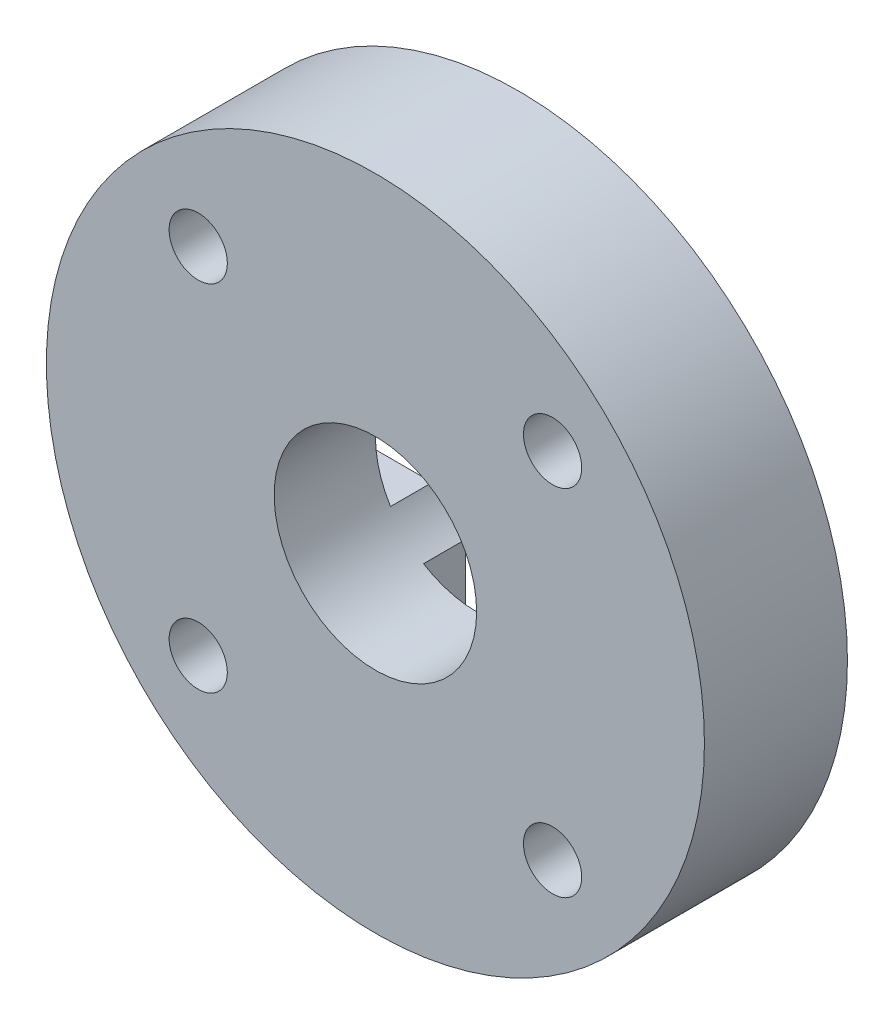
ISO-10303-21;
HEADER;
FILE_DESCRIPTION(('STEP AP214'),'2;1');
FILE_NAME('part.step','',(''),(''),'','','');
FILE_SCHEMA(('AUTOMOTIVE_DESIGN { 1 0 10303 214 1 1 1 1 }'));
ENDSEC;
DATA;
#1=APPLICATION_CONTEXT('core data for automotive mechanical design processes');
#2=APPLICATION_PROTOCOL_DEFINITION('international standard','automotive_design',2000,#1);
#3=PRODUCT_CONTEXT('',#1,'mechanical');
#4=PRODUCT('Part','Part','',(#3));
#5=PRODUCT_RELATED_PRODUCT_CATEGORY('part','',(#4));
#6=PRODUCT_DEFINITION_FORMATION('','',#4);
#7=PRODUCT_DEFINITION_CONTEXT('part definition',#1,'design');
#8=PRODUCT_DEFINITION('design','',#6,#7);
#9=PRODUCT_DEFINITION_SHAPE('','',#8);
#10=(LENGTH_UNIT() NAMED_UNIT(*) SI_UNIT(.MILLI.,.METRE.));
#11=(NAMED_UNIT(*) PLANE_ANGLE_UNIT() SI_UNIT($,.RADIAN.));
#12=(NAMED_UNIT(*) SI_UNIT($,.STERADIAN.) SOLID_ANGLE_UNIT());
#13=UNCERTAINTY_MEASURE_WITH_UNIT(LENGTH_MEASURE(1.E-05),#10,'distance_accuracy_value','');
#14=(GEOMETRIC_REPRESENTATION_CONTEXT(3) GLOBAL_UNCERTAINTY_ASSIGNED_CONTEXT((#13)) GLOBAL_UNIT_ASSIGNED_CONTEXT((#10,
#11,#12)) REPRESENTATION_CONTEXT('',''));
#15=CARTESIAN_POINT('',(0.,0.,0.));
#16=DIRECTION('',(0.,0.,1.));
#17=DIRECTION('',(1.,0.,0.));
#18=AXIS2_PLACEMENT_3D('',#15,#16,#17);
#19=CARTESIAN_POINT('',(0.,0.,-1.65));
#20=DIRECTION('',(0.,0.,1.));
#21=DIRECTION('',(1.,0.,0.));
#22=AXIS2_PLACEMENT_3D('',#19,#20,#21);
#23=PLANE('',#22);
#24=CARTESIAN_POINT('',(7.,-7.,-1.65));
#25=DIRECTION('',(0.,0.,1.));
#26=DIRECTION('',(1.,0.,0.));
#27=AXIS2_PLACEMENT_3D('',#24,#25,#26);
#28=CIRCLE('',#27,1.15);
#29=CARTESIAN_POINT('',(8.15,-7.,-1.65));
#30=VERTEX_POINT('',#29);
#31=EDGE_CURVE('E268',#30,#30,#28,.F.);
#32=ORIENTED_EDGE('',*,*,#31,.F.);
#33=EDGE_LOOP('',(#32));
#34=FACE_BOUND('',#33,.T.);
#35=CARTESIAN_POINT('',(-7.,-7.,-1.65));
#36=DIRECTION('',(0.,0.,1.));
#37=DIRECTION('',(1.,0.,0.));
#38=AXIS2_PLACEMENT_3D('',#35,#36,#37);
#39=CIRCLE('',#38,1.15);
#40=CARTESIAN_POINT('',(-5.85,-7.,-1.65));
#41=VERTEX_POINT('',#40);
#42=EDGE_CURVE('E287',#41,#41,#39,.F.);
#43=ORIENTED_EDGE('',*,*,#42,.F.);
#44=EDGE_LOOP('',(#43));
#45=FACE_BOUND('',#44,.T.);
#46=CARTESIAN_POINT('',(-7.,7.,-1.65));
#47=DIRECTION('',(0.,0.,1.));
#48=DIRECTION('',(1.,0.,0.));
#49=AXIS2_PLACEMENT_3D('',#46,#47,#48);
#50=CIRCLE('',#49,1.15);
#51=CARTESIAN_POINT('',(-5.85,7.,-1.65));
#52=VERTEX_POINT('',#51);
#53=EDGE_CURVE('E291',#52,#52,#50,.F.);
#54=ORIENTED_EDGE('',*,*,#53,.F.);
#55=EDGE_LOOP('',(#54));
#56=FACE_BOUND('',#55,.T.);
#57=CARTESIAN_POINT('',(7.,7.,-1.65));
#58=DIRECTION('',(0.,0.,1.));
#59=DIRECTION('',(1.,0.,0.));
#60=AXIS2_PLACEMENT_3D('',#57,#58,#59);
#61=CIRCLE('',#60,1.15);
#62=CARTESIAN_POINT('',(8.15,7.,-1.65));
#63=VERTEX_POINT('',#62);
#64=EDGE_CURVE('E296',#63,#63,#61,.F.);
#65=ORIENTED_EDGE('',*,*,#64,.F.);
#66=EDGE_LOOP('',(#65));
#67=FACE_BOUND('',#66,.T.);
#68=CARTESIAN_POINT('',(0.,0.,-1.65));
#69=DIRECTION('',(0.,0.,1.));
#70=DIRECTION('',(1.,0.,0.));
#71=AXIS2_PLACEMENT_3D('',#68,#69,#70);
#72=CIRCLE('',#71,13.);
#73=CARTESIAN_POINT('',(13.,0.,-1.65));
#74=VERTEX_POINT('',#73);
#75=EDGE_CURVE('E215',#74,#74,#72,.T.);
#76=ORIENTED_EDGE('',*,*,#75,.F.);
#77=EDGE_LOOP('',(#76));
#78=FACE_BOUND('',#77,.T.);
#79=DIRECTION('',(-1.,0.,0.));
#80=VECTOR('',#79,1.);
#81=CARTESIAN_POINT('',(-8.15,2.1,-1.65));
#82=LINE('',#81,#80);
#83=CARTESIAN_POINT('',(8.15,2.1,-1.65));
#84=VERTEX_POINT('',#83);
#85=CARTESIAN_POINT('',(3.40440890610984,2.1,-1.65));
#86=VERTEX_POINT('',#85);
#87=EDGE_CURVE('E173',#84,#86,#82,.T.);
#88=ORIENTED_EDGE('',*,*,#87,.T.);
#89=CARTESIAN_POINT('',(0.,0.,-1.65));
#90=DIRECTION('',(0.,0.,1.));
#91=DIRECTION('',(1.,0.,0.));
#92=AXIS2_PLACEMENT_3D('',#89,#90,#91);
#93=CIRCLE('',#92,4.);
#94=CARTESIAN_POINT('',(2.1,3.40440890610984,-1.65));
#95=VERTEX_POINT('',#94);
#96=EDGE_CURVE('E154',#86,#95,#93,.T.);
#97=ORIENTED_EDGE('',*,*,#96,.T.);
#98=DIRECTION('',(0.,1.,0.));
#99=VECTOR('',#98,1.);
#100=CARTESIAN_POINT('',(2.1,-8.15,-1.65));
#101=LINE('',#100,#99);
#102=CARTESIAN_POINT('',(2.1,8.15,-1.65));
#103=VERTEX_POINT('',#102);
#104=EDGE_CURVE('E230',#95,#103,#101,.T.);
#105=ORIENTED_EDGE('',*,*,#104,.T.);
#106=CARTESIAN_POINT('',(0.,8.15,-1.65));
#107=DIRECTION('',(0.,0.,1.));
#108=DIRECTION('',(1.,0.,0.));
#109=AXIS2_PLACEMENT_3D('',#106,#107,#108);
#110=CIRCLE('',#109,2.1);
#111=CARTESIAN_POINT('',(-2.1,8.15,-1.65));
#112=VERTEX_POINT('',#111);
#113=EDGE_CURVE('E273',#103,#112,#110,.T.);
#114=ORIENTED_EDGE('',*,*,#113,.T.);
#115=DIRECTION('',(0.,-1.,0.));
#116=VECTOR('',#115,1.);
#117=CARTESIAN_POINT('',(-2.1,-8.15,-1.65));
#118=LINE('',#117,#116);
#119=CARTESIAN_POINT('',(-2.1,3.40440890610984,-1.65));
#120=VERTEX_POINT('',#119);
#121=EDGE_CURVE('E236',#112,#120,#118,.T.);
#122=ORIENTED_EDGE('',*,*,#121,.T.);
#123=CARTESIAN_POINT('',(-3.40440890610984,2.1,-1.65));
#124=VERTEX_POINT('',#123);
#125=EDGE_CURVE('E64',#120,#124,#93,.T.);
#126=ORIENTED_EDGE('',*,*,#125,.T.);
#127=CARTESIAN_POINT('',(-8.15,2.1,-1.65));
#128=VERTEX_POINT('',#127);
#129=EDGE_CURVE('E189',#124,#128,#82,.T.);
#130=ORIENTED_EDGE('',*,*,#129,.T.);
#131=CARTESIAN_POINT('',(-8.15,0.,-1.65));
#132=DIRECTION('',(0.,0.,1.));
#133=DIRECTION('',(1.,0.,0.));
#134=AXIS2_PLACEMENT_3D('',#131,#132,#133);
#135=CIRCLE('',#134,2.1);
#136=CARTESIAN_POINT('',(-8.15,-2.1,-1.65));
#137=VERTEX_POINT('',#136);
#138=EDGE_CURVE('E278',#128,#137,#135,.T.);
#139=ORIENTED_EDGE('',*,*,#138,.T.);
#140=DIRECTION('',(1.,0.,0.));
#141=VECTOR('',#140,1.);
#142=CARTESIAN_POINT('',(-8.15,-2.1,-1.65));
#143=LINE('',#142,#141);
#144=CARTESIAN_POINT('',(-3.40440890610984,-2.1,-1.65));
#145=VERTEX_POINT('',#144);
#146=EDGE_CURVE('E191',#137,#145,#143,.T.);
#147=ORIENTED_EDGE('',*,*,#146,.T.);
#148=CARTESIAN_POINT('',(-2.1,-3.40440890610984,-1.65));
#149=VERTEX_POINT('',#148);
#150=EDGE_CURVE('E636',#145,#149,#93,.T.);
#151=ORIENTED_EDGE('',*,*,#150,.T.);
#152=CARTESIAN_POINT('',(-2.1,-8.15,-1.65));
#153=VERTEX_POINT('',#152);
#154=EDGE_CURVE('E53',#149,#153,#118,.T.);
#155=ORIENTED_EDGE('',*,*,#154,.T.);
#156=CARTESIAN_POINT('',(0.,-8.15,-1.65));
#157=DIRECTION('',(0.,0.,1.));
#158=DIRECTION('',(1.,0.,0.));
#159=AXIS2_PLACEMENT_3D('',#156,#157,#158);
#160=CIRCLE('',#159,2.1);
#161=CARTESIAN_POINT('',(2.1,-8.15,-1.65));
#162=VERTEX_POINT('',#161);
#163=EDGE_CURVE('E270',#153,#162,#160,.T.);
#164=ORIENTED_EDGE('',*,*,#163,.T.);
#165=CARTESIAN_POINT('',(2.1,-3.40440890610984,-1.65));
#166=VERTEX_POINT('',#165);
#167=EDGE_CURVE('E231',#162,#166,#101,.T.);
#168=ORIENTED_EDGE('',*,*,#167,.T.);
#169=CARTESIAN_POINT('',(3.40440890610984,-2.1,-1.65));
#170=VERTEX_POINT('',#169);
#171=EDGE_CURVE('E66',#166,#170,#93,.T.);
#172=ORIENTED_EDGE('',*,*,#171,.T.);
#173=CARTESIAN_POINT('',(8.15,-2.1,-1.65));
#174=VERTEX_POINT('',#173);
#175=EDGE_CURVE('E353',#170,#174,#143,.T.);
#176=ORIENTED_EDGE('',*,*,#175,.T.);
#177=CARTESIAN_POINT('',(8.15,0.,-1.65));
#178=DIRECTION('',(0.,0.,1.));
#179=DIRECTION('',(1.,0.,0.));
#180=AXIS2_PLACEMENT_3D('',#177,#178,#179);
#181=CIRCLE('',#180,2.1);
#182=EDGE_CURVE('E181',#174,#84,#181,.T.);
#183=ORIENTED_EDGE('',*,*,#182,.T.);
#184=EDGE_LOOP('',(#88,#97,#105,#114,#122,#126,#130,#139,#147,#151,#155,#164,#168,#172,#176,#183));
#185=FACE_BOUND('',#184,.T.);
#186=ADVANCED_FACE('F44',(#34,#45,#56,#67,#78,#185),#23,.F.);
#187=CARTESIAN_POINT('',(-8.15,-2.1,0.));
#188=DIRECTION('',(0.,1.,0.));
#189=DIRECTION('',(0.,0.,1.));
#190=AXIS2_PLACEMENT_3D('',#187,#188,#189);
#191=PLANE('',#190);
#192=ORIENTED_EDGE('',*,*,#175,.F.);
#193=DIRECTION('',(0.,0.,-1.));
#194=VECTOR('',#193,1.);
#195=CARTESIAN_POINT('',(3.40440890610984,-2.1,0.));
#196=LINE('',#195,#194);
#197=CARTESIAN_POINT('',(3.40440890610984,-2.1,0.));
#198=VERTEX_POINT('',#197);
#199=EDGE_CURVE('E176',#170,#198,#196,.F.);
#200=ORIENTED_EDGE('',*,*,#199,.T.);
#201=DIRECTION('',(1.,0.,0.));
#202=VECTOR('',#201,1.);
#203=CARTESIAN_POINT('',(-8.15,-2.1,0.));
#204=LINE('',#203,#202);
#205=CARTESIAN_POINT('',(8.15,-2.1,0.));
#206=VERTEX_POINT('',#205);
#207=EDGE_CURVE('E183',#198,#206,#204,.T.);
#208=ORIENTED_EDGE('',*,*,#207,.T.);
#209=DIRECTION('',(0.,0.,-1.));
#210=VECTOR('',#209,1.);
#211=CARTESIAN_POINT('',(8.15,-2.1,0.));
#212=LINE('',#211,#210);
#213=EDGE_CURVE('E204',#206,#174,#212,.T.);
#214=ORIENTED_EDGE('',*,*,#213,.T.);
#215=EDGE_LOOP('',(#192,#200,#208,#214));
#216=FACE_BOUND('',#215,.T.);
#217=ADVANCED_FACE('F409',(#216),#191,.T.);
#218=CARTESIAN_POINT('',(-8.15,2.1,0.));
#219=DIRECTION('',(0.,-1.,0.));
#220=DIRECTION('',(0.,0.,-1.));
#221=AXIS2_PLACEMENT_3D('',#218,#219,#220);
#222=PLANE('',#221);
#223=DIRECTION('',(-1.,0.,0.));
#224=VECTOR('',#223,1.);
#225=CARTESIAN_POINT('',(-8.15,2.1,0.));
#226=LINE('',#225,#224);
#227=CARTESIAN_POINT('',(8.15,2.1,0.));
#228=VERTEX_POINT('',#227);
#229=CARTESIAN_POINT('',(3.40440890610984,2.1,0.));
#230=VERTEX_POINT('',#229);
#231=EDGE_CURVE('E178',#228,#230,#226,.T.);
#232=ORIENTED_EDGE('',*,*,#231,.T.);
#233=DIRECTION('',(0.,0.,-1.));
#234=VECTOR('',#233,1.);
#235=CARTESIAN_POINT('',(3.40440890610984,2.1,0.));
#236=LINE('',#235,#234);
#237=EDGE_CURVE('E159',#230,#86,#236,.T.);
#238=ORIENTED_EDGE('',*,*,#237,.T.);
#239=ORIENTED_EDGE('',*,*,#87,.F.);
#240=DIRECTION('',(0.,0.,-1.));
#241=VECTOR('',#240,1.);
#242=CARTESIAN_POINT('',(8.15,2.1,0.));
#243=LINE('',#242,#241);
#244=EDGE_CURVE('E203',#228,#84,#243,.T.);
#245=ORIENTED_EDGE('',*,*,#244,.F.);
#246=EDGE_LOOP('',(#232,#238,#239,#245));
#247=FACE_BOUND('',#246,.T.);
#248=ADVANCED_FACE('F171',(#247),#222,.T.);
#249=ORIENTED_EDGE('',*,*,#129,.F.);
#250=DIRECTION('',(0.,0.,-1.));
#251=VECTOR('',#250,1.);
#252=CARTESIAN_POINT('',(-3.40440890610984,2.1,0.));
#253=LINE('',#252,#251);
#254=CARTESIAN_POINT('',(-3.40440890610984,2.1,0.));
#255=VERTEX_POINT('',#254);
#256=EDGE_CURVE('E177',#124,#255,#253,.F.);
#257=ORIENTED_EDGE('',*,*,#256,.T.);
#258=CARTESIAN_POINT('',(-8.15,2.1,0.));
#259=VERTEX_POINT('',#258);
#260=EDGE_CURVE('E359',#255,#259,#226,.T.);
#261=ORIENTED_EDGE('',*,*,#260,.T.);
#262=DIRECTION('',(0.,0.,-1.));
#263=VECTOR('',#262,1.);
#264=CARTESIAN_POINT('',(-8.15,2.1,0.));
#265=LINE('',#264,#263);
#266=EDGE_CURVE('E197',#259,#128,#265,.T.);
#267=ORIENTED_EDGE('',*,*,#266,.T.);
#268=EDGE_LOOP('',(#249,#257,#261,#267));
#269=FACE_BOUND('',#268,.T.);
#270=ADVANCED_FACE('F370',(#269),#222,.T.);
#271=CARTESIAN_POINT('',(-8.15,-2.1,0.));
#272=VERTEX_POINT('',#271);
#273=CARTESIAN_POINT('',(-3.40440890610984,-2.1,0.));
#274=VERTEX_POINT('',#273);
#275=EDGE_CURVE('E193',#272,#274,#204,.T.);
#276=ORIENTED_EDGE('',*,*,#275,.T.);
#277=DIRECTION('',(0.,0.,-1.));
#278=VECTOR('',#277,1.);
#279=CARTESIAN_POINT('',(-3.40440890610984,-2.1,0.));
#280=LINE('',#279,#278);
#281=EDGE_CURVE('E321',#274,#145,#280,.T.);
#282=ORIENTED_EDGE('',*,*,#281,.T.);
#283=ORIENTED_EDGE('',*,*,#146,.F.);
#284=DIRECTION('',(0.,0.,-1.));
#285=VECTOR('',#284,1.);
#286=CARTESIAN_POINT('',(-8.15,-2.1,0.));
#287=LINE('',#286,#285);
#288=EDGE_CURVE('E208',#272,#137,#287,.T.);
#289=ORIENTED_EDGE('',*,*,#288,.F.);
#290=EDGE_LOOP('',(#276,#282,#283,#289));
#291=FACE_BOUND('',#290,.T.);
#292=ADVANCED_FACE('F414',(#291),#191,.T.);
#293=CARTESIAN_POINT('',(2.1,-8.15,0.));
#294=DIRECTION('',(-1.,0.,0.));
#295=DIRECTION('',(0.,0.,1.));
#296=AXIS2_PLACEMENT_3D('',#293,#294,#295);
#297=PLANE('',#296);
#298=ORIENTED_EDGE('',*,*,#104,.F.);
#299=DIRECTION('',(0.,0.,-1.));
#300=VECTOR('',#299,1.);
#301=CARTESIAN_POINT('',(2.1,3.40440890610984,0.));
#302=LINE('',#301,#300);
#303=CARTESIAN_POINT('',(2.1,3.40440890610984,0.));
#304=VERTEX_POINT('',#303);
#305=EDGE_CURVE('E165',#95,#304,#302,.F.);
#306=ORIENTED_EDGE('',*,*,#305,.T.);
#307=DIRECTION('',(0.,1.,0.));
#308=VECTOR('',#307,1.);
#309=CARTESIAN_POINT('',(2.1,-8.15,0.));
#310=LINE('',#309,#308);
#311=CARTESIAN_POINT('',(2.1,8.15,0.));
#312=VERTEX_POINT('',#311);
#313=EDGE_CURVE('E257',#304,#312,#310,.T.);
#314=ORIENTED_EDGE('',*,*,#313,.T.);
#315=DIRECTION('',(0.,0.,-1.));
#316=VECTOR('',#315,1.);
#317=CARTESIAN_POINT('',(2.1,8.15,0.));
#318=LINE('',#317,#316);
#319=EDGE_CURVE('E348',#312,#103,#318,.T.);
#320=ORIENTED_EDGE('',*,*,#319,.T.);
#321=EDGE_LOOP('',(#298,#306,#314,#320));
#322=FACE_BOUND('',#321,.T.);
#323=ADVANCED_FACE('F394',(#322),#297,.T.);
#324=CARTESIAN_POINT('',(-2.1,-8.15,0.));
#325=DIRECTION('',(1.,0.,0.));
#326=DIRECTION('',(0.,0.,-1.));
#327=AXIS2_PLACEMENT_3D('',#324,#325,#326);
#328=PLANE('',#327);
#329=DIRECTION('',(0.,-1.,0.));
#330=VECTOR('',#329,1.);
#331=CARTESIAN_POINT('',(-2.1,-8.15,0.));
#332=LINE('',#331,#330);
#333=CARTESIAN_POINT('',(-2.1,8.15,0.));
#334=VERTEX_POINT('',#333);
#335=CARTESIAN_POINT('',(-2.1,3.40440890610984,0.));
#336=VERTEX_POINT('',#335);
#337=EDGE_CURVE('E246',#334,#336,#332,.T.);
#338=ORIENTED_EDGE('',*,*,#337,.T.);
#339=DIRECTION('',(0.,0.,-1.));
#340=VECTOR('',#339,1.);
#341=CARTESIAN_POINT('',(-2.1,3.40440890610984,0.));
#342=LINE('',#341,#340);
#343=EDGE_CURVE('E330',#336,#120,#342,.T.);
#344=ORIENTED_EDGE('',*,*,#343,.T.);
#345=ORIENTED_EDGE('',*,*,#121,.F.);
#346=DIRECTION('',(0.,0.,-1.));
#347=VECTOR('',#346,1.);
#348=CARTESIAN_POINT('',(-2.1,8.15,0.));
#349=LINE('',#348,#347);
#350=EDGE_CURVE('E259',#334,#112,#349,.T.);
#351=ORIENTED_EDGE('',*,*,#350,.F.);
#352=EDGE_LOOP('',(#338,#344,#345,#351));
#353=FACE_BOUND('',#352,.T.);
#354=ADVANCED_FACE('F387',(#353),#328,.T.);
#355=ORIENTED_EDGE('',*,*,#154,.F.);
#356=DIRECTION('',(0.,0.,-1.));
#357=VECTOR('',#356,1.);
#358=CARTESIAN_POINT('',(-2.1,-3.40440890610984,0.));
#359=LINE('',#358,#357);
#360=CARTESIAN_POINT('',(-2.1,-3.40440890610984,0.));
#361=VERTEX_POINT('',#360);
#362=EDGE_CURVE('E170',#149,#361,#359,.F.);
#363=ORIENTED_EDGE('',*,*,#362,.T.);
#364=CARTESIAN_POINT('',(-2.1,-8.15,0.));
#365=VERTEX_POINT('',#364);
#366=EDGE_CURVE('E241',#361,#365,#332,.T.);
#367=ORIENTED_EDGE('',*,*,#366,.T.);
#368=DIRECTION('',(0.,0.,-1.));
#369=VECTOR('',#368,1.);
#370=CARTESIAN_POINT('',(-2.1,-8.15,0.));
#371=LINE('',#370,#369);
#372=EDGE_CURVE('E349',#365,#153,#371,.T.);
#373=ORIENTED_EDGE('',*,*,#372,.T.);
#374=EDGE_LOOP('',(#355,#363,#367,#373));
#375=FACE_BOUND('',#374,.T.);
#376=ADVANCED_FACE('F331',(#375),#328,.T.);
#377=CARTESIAN_POINT('',(2.1,-8.15,0.));
#378=VERTEX_POINT('',#377);
#379=CARTESIAN_POINT('',(2.1,-3.40440890610984,0.));
#380=VERTEX_POINT('',#379);
#381=EDGE_CURVE('E258',#378,#380,#310,.T.);
#382=ORIENTED_EDGE('',*,*,#381,.T.);
#383=DIRECTION('',(0.,0.,-1.));
#384=VECTOR('',#383,1.);
#385=CARTESIAN_POINT('',(2.1,-3.40440890610984,0.));
#386=LINE('',#385,#384);
#387=EDGE_CURVE('E11',#380,#166,#386,.T.);
#388=ORIENTED_EDGE('',*,*,#387,.T.);
#389=ORIENTED_EDGE('',*,*,#167,.F.);
#390=DIRECTION('',(0.,0.,-1.));
#391=VECTOR('',#390,1.);
#392=CARTESIAN_POINT('',(2.1,-8.15,0.));
#393=LINE('',#392,#391);
#394=EDGE_CURVE('E344',#378,#162,#393,.T.);
#395=ORIENTED_EDGE('',*,*,#394,.F.);
#396=EDGE_LOOP('',(#382,#388,#389,#395));
#397=FACE_BOUND('',#396,.T.);
#398=ADVANCED_FACE('F341',(#397),#297,.T.);
#399=CARTESIAN_POINT('',(0.,0.,4.));
#400=DIRECTION('',(0.,0.,1.));
#401=DIRECTION('',(1.,0.,0.));
#402=AXIS2_PLACEMENT_3D('',#399,#400,#401);
#403=PLANE('',#402);
#404=CARTESIAN_POINT('',(7.,-7.,4.));
#405=DIRECTION('',(0.,0.,1.));
#406=DIRECTION('',(1.,0.,0.));
#407=AXIS2_PLACEMENT_3D('',#404,#405,#406);
#408=CIRCLE('',#407,1.15);
#409=CARTESIAN_POINT('',(8.15,-7.,4.));
#410=VERTEX_POINT('',#409);
#411=EDGE_CURVE('E308',#410,#410,#408,.T.);
#412=ORIENTED_EDGE('',*,*,#411,.F.);
#413=EDGE_LOOP('',(#412));
#414=FACE_BOUND('',#413,.T.);
#415=CARTESIAN_POINT('',(-7.,-7.,4.));
#416=DIRECTION('',(0.,0.,1.));
#417=DIRECTION('',(1.,0.,0.));
#418=AXIS2_PLACEMENT_3D('',#415,#416,#417);
#419=CIRCLE('',#418,1.15);
#420=CARTESIAN_POINT('',(-5.85,-7.,4.));
#421=VERTEX_POINT('',#420);
#422=EDGE_CURVE('E309',#421,#421,#419,.T.);
#423=ORIENTED_EDGE('',*,*,#422,.F.);
#424=EDGE_LOOP('',(#423));
#425=FACE_BOUND('',#424,.T.);
#426=CARTESIAN_POINT('',(-7.,7.,4.));
#427=DIRECTION('',(0.,0.,1.));
#428=DIRECTION('',(1.,0.,0.));
#429=AXIS2_PLACEMENT_3D('',#426,#427,#428);
#430=CIRCLE('',#429,1.15);
#431=CARTESIAN_POINT('',(-5.85,7.,4.));
#432=VERTEX_POINT('',#431);
#433=EDGE_CURVE('E304',#432,#432,#430,.T.);
#434=ORIENTED_EDGE('',*,*,#433,.F.);
#435=EDGE_LOOP('',(#434));
#436=FACE_BOUND('',#435,.T.);
#437=CARTESIAN_POINT('',(7.,7.,4.));
#438=DIRECTION('',(0.,0.,1.));
#439=DIRECTION('',(1.,0.,0.));
#440=AXIS2_PLACEMENT_3D('',#437,#438,#439);
#441=CIRCLE('',#440,1.15);
#442=CARTESIAN_POINT('',(8.15,7.,4.));
#443=VERTEX_POINT('',#442);
#444=EDGE_CURVE('E303',#443,#443,#441,.T.);
#445=ORIENTED_EDGE('',*,*,#444,.F.);
#446=EDGE_LOOP('',(#445));
#447=FACE_BOUND('',#446,.T.);
#448=CARTESIAN_POINT('',(0.,0.,4.));
#449=DIRECTION('',(0.,0.,1.));
#450=DIRECTION('',(1.,0.,0.));
#451=AXIS2_PLACEMENT_3D('',#448,#449,#450);
#452=CIRCLE('',#451,13.);
#453=CARTESIAN_POINT('',(13.,0.,4.));
#454=VERTEX_POINT('',#453);
#455=EDGE_CURVE('E225',#454,#454,#452,.T.);
#456=ORIENTED_EDGE('',*,*,#455,.T.);
#457=EDGE_LOOP('',(#456));
#458=FACE_BOUND('',#457,.T.);
#459=CARTESIAN_POINT('',(0.,0.,4.));
#460=DIRECTION('',(0.,0.,1.));
#461=DIRECTION('',(1.,0.,0.));
#462=AXIS2_PLACEMENT_3D('',#459,#460,#461);
#463=CIRCLE('',#462,4.);
#464=CARTESIAN_POINT('',(4.,0.,4.));
#465=VERTEX_POINT('',#464);
#466=EDGE_CURVE('E217',#465,#465,#463,.T.);
#467=ORIENTED_EDGE('',*,*,#466,.F.);
#468=EDGE_LOOP('',(#467));
#469=FACE_BOUND('',#468,.T.);
#470=ADVANCED_FACE('F421',(#414,#425,#436,#447,#458,#469),#403,.T.);
#471=CARTESIAN_POINT('',(0.,0.,4.));
#472=DIRECTION('',(0.,0.,-1.));
#473=DIRECTION('',(-1.,0.,0.));
#474=AXIS2_PLACEMENT_3D('',#471,#472,#473);
#475=CYLINDRICAL_SURFACE('',#474,13.);
#476=ORIENTED_EDGE('',*,*,#455,.F.);
#477=EDGE_LOOP('',(#476));
#478=FACE_BOUND('',#477,.T.);
#479=ORIENTED_EDGE('',*,*,#75,.T.);
#480=EDGE_LOOP('',(#479));
#481=FACE_BOUND('',#480,.T.);
#482=ADVANCED_FACE('F50',(#478,#481),#475,.T.);
#483=CARTESIAN_POINT('',(0.,0.,4.));
#484=DIRECTION('',(0.,0.,-1.));
#485=DIRECTION('',(-1.,0.,0.));
#486=AXIS2_PLACEMENT_3D('',#483,#484,#485);
#487=CYLINDRICAL_SURFACE('',#486,4.);
#488=ORIENTED_EDGE('',*,*,#466,.T.);
#489=EDGE_LOOP('',(#488));
#490=FACE_BOUND('',#489,.T.);
#491=CARTESIAN_POINT('',(0.,0.,0.));
#492=DIRECTION('',(0.,0.,1.));
#493=DIRECTION('',(1.,0.,0.));
#494=AXIS2_PLACEMENT_3D('',#491,#492,#493);
#495=CIRCLE('',#494,4.);
#496=EDGE_CURVE('E224',#304,#336,#495,.T.);
#497=ORIENTED_EDGE('',*,*,#496,.F.);
#498=ORIENTED_EDGE('',*,*,#305,.F.);
#499=ORIENTED_EDGE('',*,*,#96,.F.);
#500=ORIENTED_EDGE('',*,*,#237,.F.);
#501=EDGE_CURVE('E211',#198,#230,#495,.T.);
#502=ORIENTED_EDGE('',*,*,#501,.F.);
#503=ORIENTED_EDGE('',*,*,#199,.F.);
#504=ORIENTED_EDGE('',*,*,#171,.F.);
#505=ORIENTED_EDGE('',*,*,#387,.F.);
#506=EDGE_CURVE('E216',#361,#380,#495,.T.);
#507=ORIENTED_EDGE('',*,*,#506,.F.);
#508=ORIENTED_EDGE('',*,*,#362,.F.);
#509=ORIENTED_EDGE('',*,*,#150,.F.);
#510=ORIENTED_EDGE('',*,*,#281,.F.);
#511=EDGE_CURVE('E220',#255,#274,#495,.T.);
#512=ORIENTED_EDGE('',*,*,#511,.F.);
#513=ORIENTED_EDGE('',*,*,#256,.F.);
#514=ORIENTED_EDGE('',*,*,#125,.F.);
#515=ORIENTED_EDGE('',*,*,#343,.F.);
#516=EDGE_LOOP('',(#497,#498,#499,#500,#502,#503,#504,#505,#507,#508,#509,#510,#512,#513,#514,#515));
#517=FACE_BOUND('',#516,.T.);
#518=ADVANCED_FACE('F158',(#490,#517),#487,.F.);
#519=CARTESIAN_POINT('',(0.,0.,0.));
#520=DIRECTION('',(0.,0.,-1.));
#521=DIRECTION('',(-1.,0.,0.));
#522=AXIS2_PLACEMENT_3D('',#519,#520,#521);
#523=PLANE('',#522);
#524=ORIENTED_EDGE('',*,*,#231,.F.);
#525=CARTESIAN_POINT('',(8.15,0.,0.));
#526=DIRECTION('',(0.,0.,1.));
#527=DIRECTION('',(1.,0.,0.));
#528=AXIS2_PLACEMENT_3D('',#525,#526,#527);
#529=CIRCLE('',#528,2.1);
#530=EDGE_CURVE('E253',#206,#228,#529,.T.);
#531=ORIENTED_EDGE('',*,*,#530,.F.);
#532=ORIENTED_EDGE('',*,*,#207,.F.);
#533=ORIENTED_EDGE('',*,*,#501,.T.);
#534=EDGE_LOOP('',(#524,#531,#532,#533));
#535=FACE_BOUND('',#534,.T.);
#536=ADVANCED_FACE('F423',(#535),#523,.T.);
#537=ORIENTED_EDGE('',*,*,#275,.F.);
#538=CARTESIAN_POINT('',(-8.15,0.,0.));
#539=DIRECTION('',(0.,0.,1.));
#540=DIRECTION('',(1.,0.,0.));
#541=AXIS2_PLACEMENT_3D('',#538,#539,#540);
#542=CIRCLE('',#541,2.1);
#543=EDGE_CURVE('E280',#259,#272,#542,.T.);
#544=ORIENTED_EDGE('',*,*,#543,.F.);
#545=ORIENTED_EDGE('',*,*,#260,.F.);
#546=ORIENTED_EDGE('',*,*,#511,.T.);
#547=EDGE_LOOP('',(#537,#544,#545,#546));
#548=FACE_BOUND('',#547,.T.);
#549=ADVANCED_FACE('F373',(#548),#523,.T.);
#550=CARTESIAN_POINT('',(0.,0.,0.));
#551=DIRECTION('',(0.,0.,-1.));
#552=DIRECTION('',(-1.,0.,0.));
#553=AXIS2_PLACEMENT_3D('',#550,#551,#552);
#554=PLANE('',#553);
#555=ORIENTED_EDGE('',*,*,#337,.F.);
#556=CARTESIAN_POINT('',(0.,8.15,0.));
#557=DIRECTION('',(0.,0.,1.));
#558=DIRECTION('',(1.,0.,0.));
#559=AXIS2_PLACEMENT_3D('',#556,#557,#558);
#560=CIRCLE('',#559,2.1);
#561=EDGE_CURVE('E271',#312,#334,#560,.T.);
#562=ORIENTED_EDGE('',*,*,#561,.F.);
#563=ORIENTED_EDGE('',*,*,#313,.F.);
#564=ORIENTED_EDGE('',*,*,#496,.T.);
#565=EDGE_LOOP('',(#555,#562,#563,#564));
#566=FACE_BOUND('',#565,.T.);
#567=ADVANCED_FACE('F381',(#566),#554,.T.);
#568=ORIENTED_EDGE('',*,*,#381,.F.);
#569=CARTESIAN_POINT('',(0.,-8.15,0.));
#570=DIRECTION('',(0.,0.,1.));
#571=DIRECTION('',(1.,0.,0.));
#572=AXIS2_PLACEMENT_3D('',#569,#570,#571);
#573=CIRCLE('',#572,2.1);
#574=EDGE_CURVE('E262',#365,#378,#573,.T.);
#575=ORIENTED_EDGE('',*,*,#574,.F.);
#576=ORIENTED_EDGE('',*,*,#366,.F.);
#577=ORIENTED_EDGE('',*,*,#506,.T.);
#578=EDGE_LOOP('',(#568,#575,#576,#577));
#579=FACE_BOUND('',#578,.T.);
#580=ADVANCED_FACE('F343',(#579),#554,.T.);
#581=CARTESIAN_POINT('',(0.,-8.15,0.));
#582=DIRECTION('',(0.,0.,-1.));
#583=DIRECTION('',(-1.,0.,0.));
#584=AXIS2_PLACEMENT_3D('',#581,#582,#583);
#585=CYLINDRICAL_SURFACE('',#584,2.1);
#586=ORIENTED_EDGE('',*,*,#163,.F.);
#587=ORIENTED_EDGE('',*,*,#372,.F.);
#588=ORIENTED_EDGE('',*,*,#574,.T.);
#589=ORIENTED_EDGE('',*,*,#394,.T.);
#590=EDGE_LOOP('',(#586,#587,#588,#589));
#591=FACE_BOUND('',#590,.T.);
#592=ADVANCED_FACE('F392',(#591),#585,.F.);
#593=CARTESIAN_POINT('',(0.,8.15,0.));
#594=DIRECTION('',(0.,0.,-1.));
#595=DIRECTION('',(-1.,0.,0.));
#596=AXIS2_PLACEMENT_3D('',#593,#594,#595);
#597=CYLINDRICAL_SURFACE('',#596,2.1);
#598=ORIENTED_EDGE('',*,*,#319,.F.);
#599=ORIENTED_EDGE('',*,*,#561,.T.);
#600=ORIENTED_EDGE('',*,*,#350,.T.);
#601=ORIENTED_EDGE('',*,*,#113,.F.);
#602=EDGE_LOOP('',(#598,#599,#600,#601));
#603=FACE_BOUND('',#602,.T.);
#604=ADVANCED_FACE('F391',(#603),#597,.F.);
#605=CARTESIAN_POINT('',(-8.15,0.,0.));
#606=DIRECTION('',(0.,0.,-1.));
#607=DIRECTION('',(-1.,0.,0.));
#608=AXIS2_PLACEMENT_3D('',#605,#606,#607);
#609=CYLINDRICAL_SURFACE('',#608,2.1);
#610=ORIENTED_EDGE('',*,*,#543,.T.);
#611=ORIENTED_EDGE('',*,*,#288,.T.);
#612=ORIENTED_EDGE('',*,*,#138,.F.);
#613=ORIENTED_EDGE('',*,*,#266,.F.);
#614=EDGE_LOOP('',(#610,#611,#612,#613));
#615=FACE_BOUND('',#614,.T.);
#616=ADVANCED_FACE('F393',(#615),#609,.F.);
#617=CARTESIAN_POINT('',(8.15,0.,0.));
#618=DIRECTION('',(0.,0.,-1.));
#619=DIRECTION('',(-1.,0.,0.));
#620=AXIS2_PLACEMENT_3D('',#617,#618,#619);
#621=CYLINDRICAL_SURFACE('',#620,2.1);
#622=ORIENTED_EDGE('',*,*,#182,.F.);
#623=ORIENTED_EDGE('',*,*,#213,.F.);
#624=ORIENTED_EDGE('',*,*,#530,.T.);
#625=ORIENTED_EDGE('',*,*,#244,.T.);
#626=EDGE_LOOP('',(#622,#623,#624,#625));
#627=FACE_BOUND('',#626,.T.);
#628=ADVANCED_FACE('F402',(#627),#621,.F.);
#629=CARTESIAN_POINT('',(7.,7.,4.));
#630=DIRECTION('',(0.,0.,-1.));
#631=DIRECTION('',(-1.,0.,0.));
#632=AXIS2_PLACEMENT_3D('',#629,#630,#631);
#633=CYLINDRICAL_SURFACE('',#632,1.15);
#634=ORIENTED_EDGE('',*,*,#444,.T.);
#635=EDGE_LOOP('',(#634));
#636=FACE_BOUND('',#635,.T.);
#637=ORIENTED_EDGE('',*,*,#64,.T.);
#638=EDGE_LOOP('',(#637));
#639=FACE_BOUND('',#638,.T.);
#640=ADVANCED_FACE('F441',(#636,#639),#633,.F.);
#641=CARTESIAN_POINT('',(-7.,7.,4.));
#642=DIRECTION('',(0.,0.,-1.));
#643=DIRECTION('',(-1.,0.,0.));
#644=AXIS2_PLACEMENT_3D('',#641,#642,#643);
#645=CYLINDRICAL_SURFACE('',#644,1.15);
#646=ORIENTED_EDGE('',*,*,#433,.T.);
#647=EDGE_LOOP('',(#646));
#648=FACE_BOUND('',#647,.T.);
#649=ORIENTED_EDGE('',*,*,#53,.T.);
#650=EDGE_LOOP('',(#649));
#651=FACE_BOUND('',#650,.T.);
#652=ADVANCED_FACE('F449',(#648,#651),#645,.F.);
#653=CARTESIAN_POINT('',(-7.,-7.,4.));
#654=DIRECTION('',(0.,0.,-1.));
#655=DIRECTION('',(-1.,0.,0.));
#656=AXIS2_PLACEMENT_3D('',#653,#654,#655);
#657=CYLINDRICAL_SURFACE('',#656,1.15);
#658=ORIENTED_EDGE('',*,*,#422,.T.);
#659=EDGE_LOOP('',(#658));
#660=FACE_BOUND('',#659,.T.);
#661=ORIENTED_EDGE('',*,*,#42,.T.);
#662=EDGE_LOOP('',(#661));
#663=FACE_BOUND('',#662,.T.);
#664=ADVANCED_FACE('F457',(#660,#663),#657,.F.);
#665=CARTESIAN_POINT('',(7.,-7.,4.));
#666=DIRECTION('',(0.,0.,-1.));
#667=DIRECTION('',(-1.,0.,0.));
#668=AXIS2_PLACEMENT_3D('',#665,#666,#667);
#669=CYLINDRICAL_SURFACE('',#668,1.15);
#670=ORIENTED_EDGE('',*,*,#411,.T.);
#671=EDGE_LOOP('',(#670));
#672=FACE_BOUND('',#671,.T.);
#673=ORIENTED_EDGE('',*,*,#31,.T.);
#674=EDGE_LOOP('',(#673));
#675=FACE_BOUND('',#674,.T.);
#676=ADVANCED_FACE('F461',(#672,#675),#669,.F.);
#677=CLOSED_SHELL('',(#186,#217,#248,#270,#292,#323,#354,#376,#398,#470,#482,#518,#536,#549,
#567,#580,#592,#604,#616,#628,#640,#652,#664,#676));
#678=MANIFOLD_SOLID_BREP('B2',#677);
#679=ADVANCED_BREP_SHAPE_REPRESENTATION('',(#18,#678),#14);
#680=SHAPE_DEFINITION_REPRESENTATION(#9,#679);
ENDSEC;
END-ISO-10303-21;
